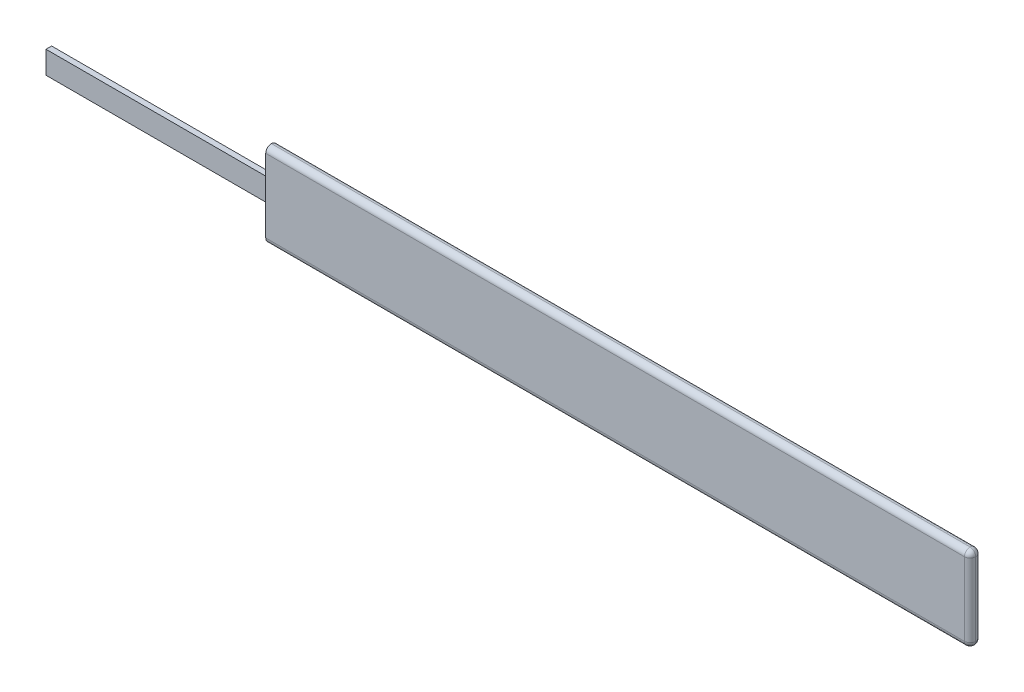
ISO-10303-21;
HEADER;
FILE_DESCRIPTION(('STEP AP214'),'2;1');
FILE_NAME('part.step','',(''),(''),'','','');
FILE_SCHEMA(('AUTOMOTIVE_DESIGN { 1 0 10303 214 1 1 1 1 }'));
ENDSEC;
DATA;
#1=APPLICATION_CONTEXT('core data for automotive mechanical design processes');
#2=APPLICATION_PROTOCOL_DEFINITION('international standard','automotive_design',2000,#1);
#3=PRODUCT_CONTEXT('',#1,'mechanical');
#4=PRODUCT('Part','Part','',(#3));
#5=PRODUCT_RELATED_PRODUCT_CATEGORY('part','',(#4));
#6=PRODUCT_DEFINITION_FORMATION('','',#4);
#7=PRODUCT_DEFINITION_CONTEXT('part definition',#1,'design');
#8=PRODUCT_DEFINITION('design','',#6,#7);
#9=PRODUCT_DEFINITION_SHAPE('','',#8);
#10=(LENGTH_UNIT() NAMED_UNIT(*) SI_UNIT(.MILLI.,.METRE.));
#11=(NAMED_UNIT(*) PLANE_ANGLE_UNIT() SI_UNIT($,.RADIAN.));
#12=(NAMED_UNIT(*) SI_UNIT($,.STERADIAN.) SOLID_ANGLE_UNIT());
#13=UNCERTAINTY_MEASURE_WITH_UNIT(LENGTH_MEASURE(1.E-05),#10,'distance_accuracy_value','');
#14=(GEOMETRIC_REPRESENTATION_CONTEXT(3) GLOBAL_UNCERTAINTY_ASSIGNED_CONTEXT((#13)) GLOBAL_UNIT_ASSIGNED_CONTEXT((#10,
#11,#12)) REPRESENTATION_CONTEXT('',''));
#15=CARTESIAN_POINT('',(0.,0.,0.));
#16=DIRECTION('',(0.,0.,1.));
#17=DIRECTION('',(1.,0.,0.));
#18=AXIS2_PLACEMENT_3D('',#15,#16,#17);
#19=CARTESIAN_POINT('',(62.5,-2.,2.));
#20=DIRECTION('',(0.,1.,0.));
#21=DIRECTION('',(0.,0.,1.));
#22=AXIS2_PLACEMENT_3D('',#19,#20,#21);
#23=PLANE('',#22);
#24=DIRECTION('',(0.,0.,-1.));
#25=VECTOR('',#24,1.);
#26=CARTESIAN_POINT('',(20.,-2.,2.));
#27=LINE('',#26,#25);
#28=CARTESIAN_POINT('',(20.,-2.,1.));
#29=VERTEX_POINT('',#28);
#30=CARTESIAN_POINT('',(20.,-2.,0.));
#31=VERTEX_POINT('',#30);
#32=EDGE_CURVE('E185',#29,#31,#27,.T.);
#33=ORIENTED_EDGE('',*,*,#32,.F.);
#34=DIRECTION('',(-1.,0.,0.));
#35=VECTOR('',#34,1.);
#36=CARTESIAN_POINT('',(20.,-2.,1.));
#37=LINE('',#36,#35);
#38=CARTESIAN_POINT('',(-20.,-2.,1.));
#39=VERTEX_POINT('',#38);
#40=EDGE_CURVE('E207',#29,#39,#37,.T.);
#41=ORIENTED_EDGE('',*,*,#40,.T.);
#42=DIRECTION('',(0.,0.,-1.));
#43=VECTOR('',#42,1.);
#44=CARTESIAN_POINT('',(-20.,-2.,2.));
#45=LINE('',#44,#43);
#46=CARTESIAN_POINT('',(-20.,-2.,0.));
#47=VERTEX_POINT('',#46);
#48=EDGE_CURVE('E192',#39,#47,#45,.T.);
#49=ORIENTED_EDGE('',*,*,#48,.T.);
#50=DIRECTION('',(1.,0.,0.));
#51=VECTOR('',#50,1.);
#52=CARTESIAN_POINT('',(62.5,-2.,0.));
#53=LINE('',#52,#51);
#54=EDGE_CURVE('E204',#47,#31,#53,.T.);
#55=ORIENTED_EDGE('',*,*,#54,.T.);
#56=EDGE_LOOP('',(#33,#41,#49,#55));
#57=FACE_BOUND('',#56,.T.);
#58=ADVANCED_FACE('F34',(#57),#23,.F.);
#59=CARTESIAN_POINT('',(20.,-129.010541008697,2.));
#60=DIRECTION('',(-1.,0.,0.));
#61=DIRECTION('',(0.,0.,1.));
#62=AXIS2_PLACEMENT_3D('',#59,#60,#61);
#63=PLANE('',#62);
#64=DIRECTION('',(0.,1.,0.));
#65=VECTOR('',#64,1.);
#66=CARTESIAN_POINT('',(20.,-129.010541008697,0.));
#67=LINE('',#66,#65);
#68=CARTESIAN_POINT('',(20.,-6.50000000000001,0.));
#69=VERTEX_POINT('',#68);
#70=EDGE_CURVE('E202',#69,#31,#67,.T.);
#71=ORIENTED_EDGE('',*,*,#70,.F.);
#72=CARTESIAN_POINT('',(20.,-6.50000000000001,1.));
#73=DIRECTION('',(-1.,0.,0.));
#74=DIRECTION('',(0.,0.,1.));
#75=AXIS2_PLACEMENT_3D('',#72,#73,#74);
#76=CIRCLE('',#75,1.);
#77=CARTESIAN_POINT('',(20.,-7.49999999999999,1.));
#78=VERTEX_POINT('',#77);
#79=EDGE_CURVE('E141',#69,#78,#76,.T.);
#80=ORIENTED_EDGE('',*,*,#79,.T.);
#81=CARTESIAN_POINT('',(20.,-6.50000000000001,1.));
#82=DIRECTION('',(-1.,0.,0.));
#83=DIRECTION('',(0.,0.,1.));
#84=AXIS2_PLACEMENT_3D('',#81,#82,#83);
#85=CIRCLE('',#84,1.);
#86=CARTESIAN_POINT('',(20.,-6.50000000000001,2.));
#87=VERTEX_POINT('',#86);
#88=EDGE_CURVE('E178',#78,#87,#85,.T.);
#89=ORIENTED_EDGE('',*,*,#88,.T.);
#90=DIRECTION('',(0.,1.,0.));
#91=VECTOR('',#90,1.);
#92=CARTESIAN_POINT('',(20.,-129.010541008697,2.));
#93=LINE('',#92,#91);
#94=CARTESIAN_POINT('',(20.,6.50000000000001,2.));
#95=VERTEX_POINT('',#94);
#96=EDGE_CURVE('E194',#87,#95,#93,.T.);
#97=ORIENTED_EDGE('',*,*,#96,.T.);
#98=CARTESIAN_POINT('',(20.,6.50000000000001,1.));
#99=DIRECTION('',(-1.,0.,0.));
#100=DIRECTION('',(0.,0.,1.));
#101=AXIS2_PLACEMENT_3D('',#98,#99,#100);
#102=CIRCLE('',#101,1.);
#103=CARTESIAN_POINT('',(20.,7.50000000000001,1.));
#104=VERTEX_POINT('',#103);
#105=EDGE_CURVE('E180',#95,#104,#102,.T.);
#106=ORIENTED_EDGE('',*,*,#105,.T.);
#107=CARTESIAN_POINT('',(20.,6.50000000000001,1.));
#108=DIRECTION('',(-1.,0.,0.));
#109=DIRECTION('',(0.,0.,1.));
#110=AXIS2_PLACEMENT_3D('',#107,#108,#109);
#111=CIRCLE('',#110,1.);
#112=CARTESIAN_POINT('',(20.,6.50000000000001,0.));
#113=VERTEX_POINT('',#112);
#114=EDGE_CURVE('E143',#104,#113,#111,.T.);
#115=ORIENTED_EDGE('',*,*,#114,.T.);
#116=CARTESIAN_POINT('',(20.,2.,0.));
#117=VERTEX_POINT('',#116);
#118=EDGE_CURVE('E201',#117,#113,#67,.T.);
#119=ORIENTED_EDGE('',*,*,#118,.F.);
#120=DIRECTION('',(0.,0.,-1.));
#121=VECTOR('',#120,1.);
#122=CARTESIAN_POINT('',(20.,2.,2.));
#123=LINE('',#122,#121);
#124=CARTESIAN_POINT('',(20.,2.,1.));
#125=VERTEX_POINT('',#124);
#126=EDGE_CURVE('E188',#125,#117,#123,.T.);
#127=ORIENTED_EDGE('',*,*,#126,.F.);
#128=DIRECTION('',(0.,-1.,0.));
#129=VECTOR('',#128,1.);
#130=CARTESIAN_POINT('',(20.,2.,1.));
#131=LINE('',#130,#129);
#132=EDGE_CURVE('E211',#125,#29,#131,.T.);
#133=ORIENTED_EDGE('',*,*,#132,.T.);
#134=ORIENTED_EDGE('',*,*,#32,.T.);
#135=EDGE_LOOP('',(#71,#80,#89,#97,#106,#115,#119,#127,#133,#134));
#136=FACE_BOUND('',#135,.T.);
#137=ADVANCED_FACE('F219',(#136),#63,.T.);
#138=CARTESIAN_POINT('',(62.5,2.,2.));
#139=DIRECTION('',(0.,1.,0.));
#140=DIRECTION('',(0.,0.,1.));
#141=AXIS2_PLACEMENT_3D('',#138,#139,#140);
#142=PLANE('',#141);
#143=DIRECTION('',(-1.,0.,0.));
#144=VECTOR('',#143,1.);
#145=CARTESIAN_POINT('',(20.,2.,1.));
#146=LINE('',#145,#144);
#147=CARTESIAN_POINT('',(-20.,2.,1.));
#148=VERTEX_POINT('',#147);
#149=EDGE_CURVE('E81',#125,#148,#146,.T.);
#150=ORIENTED_EDGE('',*,*,#149,.F.);
#151=ORIENTED_EDGE('',*,*,#126,.T.);
#152=DIRECTION('',(1.,0.,0.));
#153=VECTOR('',#152,1.);
#154=CARTESIAN_POINT('',(62.5,2.,0.));
#155=LINE('',#154,#153);
#156=CARTESIAN_POINT('',(-20.,2.,0.));
#157=VERTEX_POINT('',#156);
#158=EDGE_CURVE('E198',#157,#117,#155,.T.);
#159=ORIENTED_EDGE('',*,*,#158,.F.);
#160=DIRECTION('',(0.,0.,-1.));
#161=VECTOR('',#160,1.);
#162=CARTESIAN_POINT('',(-20.,2.,2.));
#163=LINE('',#162,#161);
#164=EDGE_CURVE('E190',#148,#157,#163,.T.);
#165=ORIENTED_EDGE('',*,*,#164,.F.);
#166=EDGE_LOOP('',(#150,#151,#159,#165));
#167=FACE_BOUND('',#166,.T.);
#168=ADVANCED_FACE('F252',(#167),#142,.T.);
#169=CARTESIAN_POINT('',(-20.,-129.010541008697,2.));
#170=DIRECTION('',(1.,0.,0.));
#171=DIRECTION('',(0.,0.,-1.));
#172=AXIS2_PLACEMENT_3D('',#169,#170,#171);
#173=PLANE('',#172);
#174=ORIENTED_EDGE('',*,*,#48,.F.);
#175=DIRECTION('',(0.,-1.,0.));
#176=VECTOR('',#175,1.);
#177=CARTESIAN_POINT('',(-20.,2.,1.));
#178=LINE('',#177,#176);
#179=EDGE_CURVE('E173',#148,#39,#178,.T.);
#180=ORIENTED_EDGE('',*,*,#179,.F.);
#181=ORIENTED_EDGE('',*,*,#164,.T.);
#182=DIRECTION('',(0.,-1.,0.));
#183=VECTOR('',#182,1.);
#184=CARTESIAN_POINT('',(-20.,-129.010541008697,0.));
#185=LINE('',#184,#183);
#186=EDGE_CURVE('E195',#157,#47,#185,.T.);
#187=ORIENTED_EDGE('',*,*,#186,.T.);
#188=EDGE_LOOP('',(#174,#180,#181,#187));
#189=FACE_BOUND('',#188,.T.);
#190=ADVANCED_FACE('F254',(#189),#173,.F.);
#191=CARTESIAN_POINT('',(62.5,-129.010541008697,2.));
#192=DIRECTION('',(0.,0.,1.));
#193=DIRECTION('',(1.,0.,0.));
#194=AXIS2_PLACEMENT_3D('',#191,#192,#193);
#195=PLANE('',#194);
#196=DIRECTION('',(1.,0.,0.));
#197=VECTOR('',#196,1.);
#198=CARTESIAN_POINT('',(145.,-6.50000000000001,2.));
#199=LINE('',#198,#197);
#200=CARTESIAN_POINT('',(144.,-6.50000000000001,2.));
#201=VERTEX_POINT('',#200);
#202=EDGE_CURVE('E170',#87,#201,#199,.T.);
#203=ORIENTED_EDGE('',*,*,#202,.T.);
#204=DIRECTION('',(0.,-1.,0.));
#205=VECTOR('',#204,1.);
#206=CARTESIAN_POINT('',(144.,-129.010541008697,2.));
#207=LINE('',#206,#205);
#208=CARTESIAN_POINT('',(144.,6.50000000000001,2.));
#209=VERTEX_POINT('',#208);
#210=EDGE_CURVE('E11',#201,#209,#207,.F.);
#211=ORIENTED_EDGE('',*,*,#210,.T.);
#212=DIRECTION('',(1.,0.,0.));
#213=VECTOR('',#212,1.);
#214=CARTESIAN_POINT('',(62.5,6.50000000000001,2.));
#215=LINE('',#214,#213);
#216=EDGE_CURVE('E175',#209,#95,#215,.F.);
#217=ORIENTED_EDGE('',*,*,#216,.T.);
#218=ORIENTED_EDGE('',*,*,#96,.F.);
#219=EDGE_LOOP('',(#203,#211,#217,#218));
#220=FACE_BOUND('',#219,.T.);
#221=ADVANCED_FACE('F231',(#220),#195,.T.);
#222=CARTESIAN_POINT('',(62.5,-129.010541008697,0.));
#223=DIRECTION('',(0.,0.,1.));
#224=DIRECTION('',(1.,0.,0.));
#225=AXIS2_PLACEMENT_3D('',#222,#223,#224);
#226=PLANE('',#225);
#227=DIRECTION('',(1.,0.,0.));
#228=VECTOR('',#227,1.);
#229=CARTESIAN_POINT('',(145.,6.50000000000001,0.));
#230=LINE('',#229,#228);
#231=CARTESIAN_POINT('',(144.,6.50000000000001,0.));
#232=VERTEX_POINT('',#231);
#233=EDGE_CURVE('E135',#113,#232,#230,.T.);
#234=ORIENTED_EDGE('',*,*,#233,.T.);
#235=DIRECTION('',(0.,-1.,0.));
#236=VECTOR('',#235,1.);
#237=CARTESIAN_POINT('',(144.,-6.50000000000001,0.));
#238=LINE('',#237,#236);
#239=CARTESIAN_POINT('',(144.,-6.50000000000001,0.));
#240=VERTEX_POINT('',#239);
#241=EDGE_CURVE('E44',#232,#240,#238,.T.);
#242=ORIENTED_EDGE('',*,*,#241,.T.);
#243=DIRECTION('',(1.,0.,0.));
#244=VECTOR('',#243,1.);
#245=CARTESIAN_POINT('',(62.5,-6.50000000000001,0.));
#246=LINE('',#245,#244);
#247=EDGE_CURVE('E131',#240,#69,#246,.F.);
#248=ORIENTED_EDGE('',*,*,#247,.T.);
#249=ORIENTED_EDGE('',*,*,#70,.T.);
#250=ORIENTED_EDGE('',*,*,#54,.F.);
#251=ORIENTED_EDGE('',*,*,#186,.F.);
#252=ORIENTED_EDGE('',*,*,#158,.T.);
#253=ORIENTED_EDGE('',*,*,#118,.T.);
#254=EDGE_LOOP('',(#234,#242,#248,#249,#250,#251,#252,#253));
#255=FACE_BOUND('',#254,.T.);
#256=ADVANCED_FACE('F130',(#255),#226,.F.);
#257=CARTESIAN_POINT('',(20.,2.,1.));
#258=DIRECTION('',(0.,0.,-1.));
#259=DIRECTION('',(-1.,0.,0.));
#260=AXIS2_PLACEMENT_3D('',#257,#258,#259);
#261=PLANE('',#260);
#262=ORIENTED_EDGE('',*,*,#179,.T.);
#263=ORIENTED_EDGE('',*,*,#40,.F.);
#264=ORIENTED_EDGE('',*,*,#132,.F.);
#265=ORIENTED_EDGE('',*,*,#149,.T.);
#266=EDGE_LOOP('',(#262,#263,#264,#265));
#267=FACE_BOUND('',#266,.T.);
#268=ADVANCED_FACE('F255',(#267),#261,.F.);
#269=CARTESIAN_POINT('',(62.5,-6.50000000000001,1.));
#270=DIRECTION('',(-1.,0.,0.));
#271=DIRECTION('',(0.,0.,1.));
#272=AXIS2_PLACEMENT_3D('',#269,#270,#271);
#273=CYLINDRICAL_SURFACE('',#272,1.);
#274=DIRECTION('',(1.,0.,0.));
#275=VECTOR('',#274,1.);
#276=CARTESIAN_POINT('',(20.,-7.50000000000001,1.));
#277=LINE('',#276,#275);
#278=CARTESIAN_POINT('',(144.,-7.50000000000001,1.));
#279=VERTEX_POINT('',#278);
#280=EDGE_CURVE('E152',#279,#78,#277,.F.);
#281=ORIENTED_EDGE('',*,*,#280,.F.);
#282=CARTESIAN_POINT('',(144.,-6.50000000000001,1.));
#283=DIRECTION('',(-1.,0.,0.));
#284=DIRECTION('',(0.,0.,1.));
#285=AXIS2_PLACEMENT_3D('',#282,#283,#284);
#286=CIRCLE('',#285,1.);
#287=EDGE_CURVE('E53',#279,#201,#286,.T.);
#288=ORIENTED_EDGE('',*,*,#287,.T.);
#289=ORIENTED_EDGE('',*,*,#202,.F.);
#290=ORIENTED_EDGE('',*,*,#88,.F.);
#291=EDGE_LOOP('',(#281,#288,#289,#290));
#292=FACE_BOUND('',#291,.T.);
#293=ADVANCED_FACE('F229',(#292),#273,.T.);
#294=CARTESIAN_POINT('',(62.5,-6.50000000000001,1.));
#295=DIRECTION('',(1.,0.,0.));
#296=DIRECTION('',(0.,0.,-1.));
#297=AXIS2_PLACEMENT_3D('',#294,#295,#296);
#298=CYLINDRICAL_SURFACE('',#297,1.);
#299=ORIENTED_EDGE('',*,*,#247,.F.);
#300=CARTESIAN_POINT('',(144.,-6.50000000000001,1.));
#301=DIRECTION('',(1.,0.,0.));
#302=DIRECTION('',(0.,0.,-1.));
#303=AXIS2_PLACEMENT_3D('',#300,#301,#302);
#304=CIRCLE('',#303,1.);
#305=EDGE_CURVE('E139',#240,#279,#304,.F.);
#306=ORIENTED_EDGE('',*,*,#305,.T.);
#307=ORIENTED_EDGE('',*,*,#280,.T.);
#308=ORIENTED_EDGE('',*,*,#79,.F.);
#309=EDGE_LOOP('',(#299,#306,#307,#308));
#310=FACE_BOUND('',#309,.T.);
#311=ADVANCED_FACE('F138',(#310),#298,.T.);
#312=CARTESIAN_POINT('',(62.5,6.50000000000001,1.));
#313=DIRECTION('',(-1.,0.,0.));
#314=DIRECTION('',(0.,0.,1.));
#315=AXIS2_PLACEMENT_3D('',#312,#313,#314);
#316=CYLINDRICAL_SURFACE('',#315,1.);
#317=DIRECTION('',(1.,0.,0.));
#318=VECTOR('',#317,1.);
#319=CARTESIAN_POINT('',(20.,7.50000000000001,1.));
#320=LINE('',#319,#318);
#321=CARTESIAN_POINT('',(144.,7.50000000000001,1.));
#322=VERTEX_POINT('',#321);
#323=EDGE_CURVE('E151',#322,#104,#320,.F.);
#324=ORIENTED_EDGE('',*,*,#323,.F.);
#325=CARTESIAN_POINT('',(144.,6.50000000000001,1.));
#326=DIRECTION('',(-1.,0.,0.));
#327=DIRECTION('',(0.,0.,1.));
#328=AXIS2_PLACEMENT_3D('',#325,#326,#327);
#329=CIRCLE('',#328,1.);
#330=EDGE_CURVE('E146',#322,#232,#329,.T.);
#331=ORIENTED_EDGE('',*,*,#330,.T.);
#332=ORIENTED_EDGE('',*,*,#233,.F.);
#333=ORIENTED_EDGE('',*,*,#114,.F.);
#334=EDGE_LOOP('',(#324,#331,#332,#333));
#335=FACE_BOUND('',#334,.T.);
#336=ADVANCED_FACE('F249',(#335),#316,.T.);
#337=CARTESIAN_POINT('',(62.5,6.50000000000001,1.));
#338=DIRECTION('',(1.,0.,0.));
#339=DIRECTION('',(0.,0.,-1.));
#340=AXIS2_PLACEMENT_3D('',#337,#338,#339);
#341=CYLINDRICAL_SURFACE('',#340,1.);
#342=ORIENTED_EDGE('',*,*,#216,.F.);
#343=CARTESIAN_POINT('',(144.,6.50000000000001,1.));
#344=DIRECTION('',(1.,0.,0.));
#345=DIRECTION('',(0.,0.,-1.));
#346=AXIS2_PLACEMENT_3D('',#343,#344,#345);
#347=CIRCLE('',#346,1.);
#348=EDGE_CURVE('E168',#209,#322,#347,.F.);
#349=ORIENTED_EDGE('',*,*,#348,.T.);
#350=ORIENTED_EDGE('',*,*,#323,.T.);
#351=ORIENTED_EDGE('',*,*,#105,.F.);
#352=EDGE_LOOP('',(#342,#349,#350,#351));
#353=FACE_BOUND('',#352,.T.);
#354=ADVANCED_FACE('F245',(#353),#341,.T.);
#355=CARTESIAN_POINT('',(144.,-6.50000000000001,1.));
#356=DIRECTION('',(0.,0.,1.));
#357=DIRECTION('',(1.,0.,0.));
#358=AXIS2_PLACEMENT_3D('',#355,#356,#357);
#359=SPHERICAL_SURFACE('',#358,1.);
#360=CARTESIAN_POINT('',(144.,-6.50000000000001,1.));
#361=DIRECTION('',(0.,0.,1.));
#362=DIRECTION('',(1.,0.,0.));
#363=AXIS2_PLACEMENT_3D('',#360,#361,#362);
#364=CIRCLE('',#363,1.);
#365=CARTESIAN_POINT('',(145.,-6.50000000000001,1.));
#366=VERTEX_POINT('',#365);
#367=EDGE_CURVE('E145',#279,#366,#364,.T.);
#368=ORIENTED_EDGE('',*,*,#367,.F.);
#369=ORIENTED_EDGE('',*,*,#305,.F.);
#370=CARTESIAN_POINT('',(144.,-6.50000000000001,1.));
#371=DIRECTION('',(0.,1.,0.));
#372=DIRECTION('',(0.,0.,1.));
#373=AXIS2_PLACEMENT_3D('',#370,#371,#372);
#374=CIRCLE('',#373,1.);
#375=EDGE_CURVE('E38',#366,#240,#374,.T.);
#376=ORIENTED_EDGE('',*,*,#375,.F.);
#377=EDGE_LOOP('',(#368,#369,#376));
#378=FACE_BOUND('',#377,.T.);
#379=ADVANCED_FACE('F36',(#378),#359,.T.);
#380=CARTESIAN_POINT('',(144.,-129.010541008697,1.));
#381=DIRECTION('',(0.,1.,0.));
#382=DIRECTION('',(0.,0.,1.));
#383=AXIS2_PLACEMENT_3D('',#380,#381,#382);
#384=CYLINDRICAL_SURFACE('',#383,1.);
#385=ORIENTED_EDGE('',*,*,#375,.T.);
#386=ORIENTED_EDGE('',*,*,#241,.F.);
#387=CARTESIAN_POINT('',(144.,6.50000000000001,1.));
#388=DIRECTION('',(0.,1.,0.));
#389=DIRECTION('',(0.,0.,1.));
#390=AXIS2_PLACEMENT_3D('',#387,#388,#389);
#391=CIRCLE('',#390,1.);
#392=CARTESIAN_POINT('',(145.,6.50000000000001,1.));
#393=VERTEX_POINT('',#392);
#394=EDGE_CURVE('E65',#393,#232,#391,.T.);
#395=ORIENTED_EDGE('',*,*,#394,.F.);
#396=DIRECTION('',(0.,-1.,0.));
#397=VECTOR('',#396,1.);
#398=CARTESIAN_POINT('',(145.,6.50000000000001,1.));
#399=LINE('',#398,#397);
#400=EDGE_CURVE('E149',#366,#393,#399,.F.);
#401=ORIENTED_EDGE('',*,*,#400,.F.);
#402=EDGE_LOOP('',(#385,#386,#395,#401));
#403=FACE_BOUND('',#402,.T.);
#404=ADVANCED_FACE('F148',(#403),#384,.T.);
#405=CARTESIAN_POINT('',(144.,-6.50000000000001,1.));
#406=DIRECTION('',(0.,0.,1.));
#407=DIRECTION('',(1.,0.,0.));
#408=AXIS2_PLACEMENT_3D('',#405,#406,#407);
#409=SPHERICAL_SURFACE('',#408,1.);
#410=ORIENTED_EDGE('',*,*,#287,.F.);
#411=ORIENTED_EDGE('',*,*,#367,.T.);
#412=CARTESIAN_POINT('',(144.,-6.50000000000001,1.));
#413=DIRECTION('',(0.,1.,0.));
#414=DIRECTION('',(0.,0.,1.));
#415=AXIS2_PLACEMENT_3D('',#412,#413,#414);
#416=CIRCLE('',#415,1.);
#417=EDGE_CURVE('E159',#201,#366,#416,.T.);
#418=ORIENTED_EDGE('',*,*,#417,.F.);
#419=EDGE_LOOP('',(#410,#411,#418));
#420=FACE_BOUND('',#419,.T.);
#421=ADVANCED_FACE('F234',(#420),#409,.T.);
#422=CARTESIAN_POINT('',(144.,6.50000000000001,1.));
#423=DIRECTION('',(0.,0.,1.));
#424=DIRECTION('',(1.,0.,0.));
#425=AXIS2_PLACEMENT_3D('',#422,#423,#424);
#426=SPHERICAL_SURFACE('',#425,1.);
#427=ORIENTED_EDGE('',*,*,#394,.T.);
#428=ORIENTED_EDGE('',*,*,#330,.F.);
#429=CARTESIAN_POINT('',(144.,6.50000000000001,1.));
#430=DIRECTION('',(0.,0.,1.));
#431=DIRECTION('',(1.,0.,0.));
#432=AXIS2_PLACEMENT_3D('',#429,#430,#431);
#433=CIRCLE('',#432,1.);
#434=EDGE_CURVE('E161',#393,#322,#433,.T.);
#435=ORIENTED_EDGE('',*,*,#434,.F.);
#436=EDGE_LOOP('',(#427,#428,#435));
#437=FACE_BOUND('',#436,.T.);
#438=ADVANCED_FACE('F283',(#437),#426,.T.);
#439=CARTESIAN_POINT('',(144.,-129.010541008697,1.));
#440=DIRECTION('',(0.,-1.,0.));
#441=DIRECTION('',(0.,0.,-1.));
#442=AXIS2_PLACEMENT_3D('',#439,#440,#441);
#443=CYLINDRICAL_SURFACE('',#442,1.);
#444=ORIENTED_EDGE('',*,*,#417,.T.);
#445=ORIENTED_EDGE('',*,*,#400,.T.);
#446=CARTESIAN_POINT('',(144.,6.50000000000001,1.));
#447=DIRECTION('',(0.,1.,0.));
#448=DIRECTION('',(-1.,0.,0.));
#449=AXIS2_PLACEMENT_3D('',#446,#447,#448);
#450=CIRCLE('',#449,1.);
#451=EDGE_CURVE('E163',#209,#393,#450,.T.);
#452=ORIENTED_EDGE('',*,*,#451,.F.);
#453=ORIENTED_EDGE('',*,*,#210,.F.);
#454=EDGE_LOOP('',(#444,#445,#452,#453));
#455=FACE_BOUND('',#454,.T.);
#456=ADVANCED_FACE('F237',(#455),#443,.T.);
#457=CARTESIAN_POINT('',(144.,6.50000000000001,1.));
#458=DIRECTION('',(0.,0.,1.));
#459=DIRECTION('',(1.,0.,0.));
#460=AXIS2_PLACEMENT_3D('',#457,#458,#459);
#461=SPHERICAL_SURFACE('',#460,1.);
#462=ORIENTED_EDGE('',*,*,#434,.T.);
#463=ORIENTED_EDGE('',*,*,#348,.F.);
#464=ORIENTED_EDGE('',*,*,#451,.T.);
#465=EDGE_LOOP('',(#462,#463,#464));
#466=FACE_BOUND('',#465,.T.);
#467=ADVANCED_FACE('F241',(#466),#461,.T.);
#468=CLOSED_SHELL('',(#58,#137,#168,#190,#221,#256,#268,#293,#311,#336,#354,#379,#404,#421,#438,
#456,#467));
#469=MANIFOLD_SOLID_BREP('B2',#468);
#470=ADVANCED_BREP_SHAPE_REPRESENTATION('',(#18,#469),#14);
#471=SHAPE_DEFINITION_REPRESENTATION(#9,#470);
ENDSEC;
END-ISO-10303-21;
